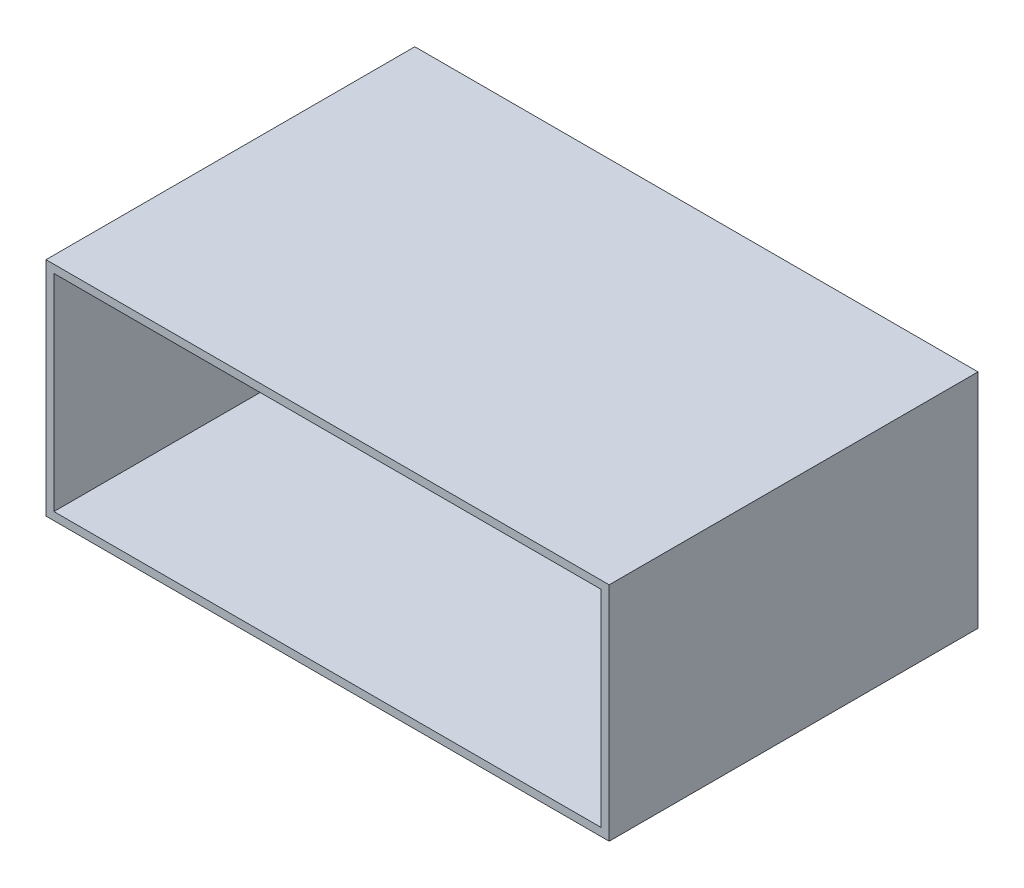
ISO-10303-21;
HEADER;
FILE_DESCRIPTION(('STEP AP214'),'2;1');
FILE_NAME('part.step','',(''),(''),'','','');
FILE_SCHEMA(('AUTOMOTIVE_DESIGN { 1 0 10303 214 1 1 1 1 }'));
ENDSEC;
DATA;
#1=APPLICATION_CONTEXT('core data for automotive mechanical design processes');
#2=APPLICATION_PROTOCOL_DEFINITION('international standard','automotive_design',2000,#1);
#3=PRODUCT_CONTEXT('',#1,'mechanical');
#4=PRODUCT('Part','Part','',(#3));
#5=PRODUCT_RELATED_PRODUCT_CATEGORY('part','',(#4));
#6=PRODUCT_DEFINITION_FORMATION('','',#4);
#7=PRODUCT_DEFINITION_CONTEXT('part definition',#1,'design');
#8=PRODUCT_DEFINITION('design','',#6,#7);
#9=PRODUCT_DEFINITION_SHAPE('','',#8);
#10=(LENGTH_UNIT() NAMED_UNIT(*) SI_UNIT(.MILLI.,.METRE.));
#11=(NAMED_UNIT(*) PLANE_ANGLE_UNIT() SI_UNIT($,.RADIAN.));
#12=(NAMED_UNIT(*) SI_UNIT($,.STERADIAN.) SOLID_ANGLE_UNIT());
#13=UNCERTAINTY_MEASURE_WITH_UNIT(LENGTH_MEASURE(1.E-05),#10,'distance_accuracy_value','');
#14=(GEOMETRIC_REPRESENTATION_CONTEXT(3) GLOBAL_UNCERTAINTY_ASSIGNED_CONTEXT((#13)) GLOBAL_UNIT_ASSIGNED_CONTEXT((#10,
#11,#12)) REPRESENTATION_CONTEXT('',''));
#15=CARTESIAN_POINT('',(0.,0.,0.));
#16=DIRECTION('',(0.,0.,1.));
#17=DIRECTION('',(1.,0.,0.));
#18=AXIS2_PLACEMENT_3D('',#15,#16,#17);
#19=CARTESIAN_POINT('',(0.,0.,93.));
#20=DIRECTION('',(0.,0.,-1.));
#21=DIRECTION('',(-1.,0.,0.));
#22=AXIS2_PLACEMENT_3D('',#19,#20,#21);
#23=PLANE('',#22);
#24=DIRECTION('',(0.,-1.,0.));
#25=VECTOR('',#24,1.);
#26=CARTESIAN_POINT('',(0.,0.,93.));
#27=LINE('',#26,#25);
#28=CARTESIAN_POINT('',(0.,56.,93.));
#29=VERTEX_POINT('',#28);
#30=CARTESIAN_POINT('',(0.,0.,93.));
#31=VERTEX_POINT('',#30);
#32=EDGE_CURVE('E144',#29,#31,#27,.T.);
#33=ORIENTED_EDGE('',*,*,#32,.T.);
#34=DIRECTION('',(1.,0.,0.));
#35=VECTOR('',#34,1.);
#36=CARTESIAN_POINT('',(0.,0.,93.));
#37=LINE('',#36,#35);
#38=CARTESIAN_POINT('',(142.,0.,93.));
#39=VERTEX_POINT('',#38);
#40=EDGE_CURVE('E146',#31,#39,#37,.T.);
#41=ORIENTED_EDGE('',*,*,#40,.T.);
#42=DIRECTION('',(0.,1.,0.));
#43=VECTOR('',#42,1.);
#44=CARTESIAN_POINT('',(142.,0.,93.));
#45=LINE('',#44,#43);
#46=CARTESIAN_POINT('',(142.,56.,93.));
#47=VERTEX_POINT('',#46);
#48=EDGE_CURVE('E151',#39,#47,#45,.T.);
#49=ORIENTED_EDGE('',*,*,#48,.T.);
#50=DIRECTION('',(-1.,0.,0.));
#51=VECTOR('',#50,1.);
#52=CARTESIAN_POINT('',(0.,56.,93.));
#53=LINE('',#52,#51);
#54=EDGE_CURVE('E153',#47,#29,#53,.T.);
#55=ORIENTED_EDGE('',*,*,#54,.T.);
#56=EDGE_LOOP('',(#33,#41,#49,#55));
#57=FACE_BOUND('',#56,.T.);
#58=DIRECTION('',(0.,-1.,0.));
#59=VECTOR('',#58,1.);
#60=CARTESIAN_POINT('',(2.,2.,93.));
#61=LINE('',#60,#59);
#62=CARTESIAN_POINT('',(2.,54.,93.));
#63=VERTEX_POINT('',#62);
#64=CARTESIAN_POINT('',(2.,2.,93.));
#65=VERTEX_POINT('',#64);
#66=EDGE_CURVE('E126',#63,#65,#61,.T.);
#67=ORIENTED_EDGE('',*,*,#66,.F.);
#68=DIRECTION('',(-1.,0.,0.));
#69=VECTOR('',#68,1.);
#70=CARTESIAN_POINT('',(2.,54.,93.));
#71=LINE('',#70,#69);
#72=CARTESIAN_POINT('',(140.,54.,93.));
#73=VERTEX_POINT('',#72);
#74=EDGE_CURVE('E117',#73,#63,#71,.T.);
#75=ORIENTED_EDGE('',*,*,#74,.F.);
#76=DIRECTION('',(0.,1.,0.));
#77=VECTOR('',#76,1.);
#78=CARTESIAN_POINT('',(140.,2.,93.));
#79=LINE('',#78,#77);
#80=CARTESIAN_POINT('',(140.,2.,93.));
#81=VERTEX_POINT('',#80);
#82=EDGE_CURVE('E137',#81,#73,#79,.T.);
#83=ORIENTED_EDGE('',*,*,#82,.F.);
#84=DIRECTION('',(1.,0.,0.));
#85=VECTOR('',#84,1.);
#86=CARTESIAN_POINT('',(2.,2.,93.));
#87=LINE('',#86,#85);
#88=EDGE_CURVE('E128',#65,#81,#87,.T.);
#89=ORIENTED_EDGE('',*,*,#88,.F.);
#90=EDGE_LOOP('',(#67,#75,#83,#89));
#91=FACE_BOUND('',#90,.T.);
#92=ADVANCED_FACE('F43',(#57,#91),#23,.F.);
#93=CARTESIAN_POINT('',(0.,0.,0.));
#94=DIRECTION('',(0.,0.,-1.));
#95=DIRECTION('',(-1.,0.,0.));
#96=AXIS2_PLACEMENT_3D('',#93,#94,#95);
#97=PLANE('',#96);
#98=DIRECTION('',(0.,-1.,0.));
#99=VECTOR('',#98,1.);
#100=CARTESIAN_POINT('',(0.,0.,0.));
#101=LINE('',#100,#99);
#102=CARTESIAN_POINT('',(0.,56.,0.));
#103=VERTEX_POINT('',#102);
#104=CARTESIAN_POINT('',(0.,0.,0.));
#105=VERTEX_POINT('',#104);
#106=EDGE_CURVE('E145',#103,#105,#101,.T.);
#107=ORIENTED_EDGE('',*,*,#106,.F.);
#108=DIRECTION('',(-1.,0.,0.));
#109=VECTOR('',#108,1.);
#110=CARTESIAN_POINT('',(0.,56.,0.));
#111=LINE('',#110,#109);
#112=CARTESIAN_POINT('',(142.,56.,0.));
#113=VERTEX_POINT('',#112);
#114=EDGE_CURVE('E149',#113,#103,#111,.T.);
#115=ORIENTED_EDGE('',*,*,#114,.F.);
#116=DIRECTION('',(0.,1.,0.));
#117=VECTOR('',#116,1.);
#118=CARTESIAN_POINT('',(142.,0.,0.));
#119=LINE('',#118,#117);
#120=CARTESIAN_POINT('',(142.,0.,0.));
#121=VERTEX_POINT('',#120);
#122=EDGE_CURVE('E159',#121,#113,#119,.T.);
#123=ORIENTED_EDGE('',*,*,#122,.F.);
#124=DIRECTION('',(1.,0.,0.));
#125=VECTOR('',#124,1.);
#126=CARTESIAN_POINT('',(0.,0.,0.));
#127=LINE('',#126,#125);
#128=EDGE_CURVE('E158',#105,#121,#127,.T.);
#129=ORIENTED_EDGE('',*,*,#128,.F.);
#130=EDGE_LOOP('',(#107,#115,#123,#129));
#131=FACE_BOUND('',#130,.T.);
#132=ADVANCED_FACE('F180',(#131),#97,.T.);
#133=CARTESIAN_POINT('',(0.,0.,93.));
#134=DIRECTION('',(1.,0.,0.));
#135=DIRECTION('',(0.,0.,-1.));
#136=AXIS2_PLACEMENT_3D('',#133,#134,#135);
#137=PLANE('',#136);
#138=ORIENTED_EDGE('',*,*,#106,.T.);
#139=DIRECTION('',(0.,0.,-1.));
#140=VECTOR('',#139,1.);
#141=CARTESIAN_POINT('',(0.,0.,93.));
#142=LINE('',#141,#140);
#143=EDGE_CURVE('E11',#31,#105,#142,.T.);
#144=ORIENTED_EDGE('',*,*,#143,.F.);
#145=ORIENTED_EDGE('',*,*,#32,.F.);
#146=DIRECTION('',(0.,0.,-1.));
#147=VECTOR('',#146,1.);
#148=CARTESIAN_POINT('',(0.,56.,93.));
#149=LINE('',#148,#147);
#150=EDGE_CURVE('E154',#29,#103,#149,.T.);
#151=ORIENTED_EDGE('',*,*,#150,.T.);
#152=EDGE_LOOP('',(#138,#144,#145,#151));
#153=FACE_BOUND('',#152,.T.);
#154=ADVANCED_FACE('F44',(#153),#137,.F.);
#155=CARTESIAN_POINT('',(0.,0.,93.));
#156=DIRECTION('',(0.,1.,0.));
#157=DIRECTION('',(0.,0.,1.));
#158=AXIS2_PLACEMENT_3D('',#155,#156,#157);
#159=PLANE('',#158);
#160=ORIENTED_EDGE('',*,*,#128,.T.);
#161=DIRECTION('',(0.,0.,-1.));
#162=VECTOR('',#161,1.);
#163=CARTESIAN_POINT('',(142.,0.,93.));
#164=LINE('',#163,#162);
#165=EDGE_CURVE('E51',#39,#121,#164,.T.);
#166=ORIENTED_EDGE('',*,*,#165,.F.);
#167=ORIENTED_EDGE('',*,*,#40,.F.);
#168=ORIENTED_EDGE('',*,*,#143,.T.);
#169=EDGE_LOOP('',(#160,#166,#167,#168));
#170=FACE_BOUND('',#169,.T.);
#171=ADVANCED_FACE('F189',(#170),#159,.F.);
#172=CARTESIAN_POINT('',(142.,0.,93.));
#173=DIRECTION('',(-1.,0.,0.));
#174=DIRECTION('',(0.,0.,1.));
#175=AXIS2_PLACEMENT_3D('',#172,#173,#174);
#176=PLANE('',#175);
#177=ORIENTED_EDGE('',*,*,#122,.T.);
#178=DIRECTION('',(0.,0.,-1.));
#179=VECTOR('',#178,1.);
#180=CARTESIAN_POINT('',(142.,56.,93.));
#181=LINE('',#180,#179);
#182=EDGE_CURVE('E164',#47,#113,#181,.T.);
#183=ORIENTED_EDGE('',*,*,#182,.F.);
#184=ORIENTED_EDGE('',*,*,#48,.F.);
#185=ORIENTED_EDGE('',*,*,#165,.T.);
#186=EDGE_LOOP('',(#177,#183,#184,#185));
#187=FACE_BOUND('',#186,.T.);
#188=ADVANCED_FACE('F175',(#187),#176,.F.);
#189=CARTESIAN_POINT('',(0.,56.,93.));
#190=DIRECTION('',(0.,-1.,0.));
#191=DIRECTION('',(0.,0.,-1.));
#192=AXIS2_PLACEMENT_3D('',#189,#190,#191);
#193=PLANE('',#192);
#194=ORIENTED_EDGE('',*,*,#114,.T.);
#195=ORIENTED_EDGE('',*,*,#150,.F.);
#196=ORIENTED_EDGE('',*,*,#54,.F.);
#197=ORIENTED_EDGE('',*,*,#182,.T.);
#198=EDGE_LOOP('',(#194,#195,#196,#197));
#199=FACE_BOUND('',#198,.T.);
#200=ADVANCED_FACE('F182',(#199),#193,.F.);
#201=CARTESIAN_POINT('',(2.,2.,93.));
#202=DIRECTION('',(1.,0.,0.));
#203=DIRECTION('',(0.,0.,-1.));
#204=AXIS2_PLACEMENT_3D('',#201,#202,#203);
#205=PLANE('',#204);
#206=DIRECTION('',(0.,-1.,0.));
#207=VECTOR('',#206,1.);
#208=CARTESIAN_POINT('',(2.,2.,2.));
#209=LINE('',#208,#207);
#210=CARTESIAN_POINT('',(2.,54.,2.));
#211=VERTEX_POINT('',#210);
#212=CARTESIAN_POINT('',(2.,2.,2.00000000000003));
#213=VERTEX_POINT('',#212);
#214=EDGE_CURVE('E124',#211,#213,#209,.T.);
#215=ORIENTED_EDGE('',*,*,#214,.F.);
#216=DIRECTION('',(0.,0.,-1.));
#217=VECTOR('',#216,1.);
#218=CARTESIAN_POINT('',(2.,54.,93.));
#219=LINE('',#218,#217);
#220=EDGE_CURVE('E109',#63,#211,#219,.T.);
#221=ORIENTED_EDGE('',*,*,#220,.F.);
#222=ORIENTED_EDGE('',*,*,#66,.T.);
#223=DIRECTION('',(0.,0.,-1.));
#224=VECTOR('',#223,1.);
#225=CARTESIAN_POINT('',(2.,2.,93.));
#226=LINE('',#225,#224);
#227=EDGE_CURVE('E121',#65,#213,#226,.T.);
#228=ORIENTED_EDGE('',*,*,#227,.T.);
#229=EDGE_LOOP('',(#215,#221,#222,#228));
#230=FACE_BOUND('',#229,.T.);
#231=ADVANCED_FACE('F125',(#230),#205,.T.);
#232=CARTESIAN_POINT('',(2.,2.,93.));
#233=DIRECTION('',(0.,1.,0.));
#234=DIRECTION('',(0.,0.,1.));
#235=AXIS2_PLACEMENT_3D('',#232,#233,#234);
#236=PLANE('',#235);
#237=DIRECTION('',(1.,0.,0.));
#238=VECTOR('',#237,1.);
#239=CARTESIAN_POINT('',(2.,2.,2.));
#240=LINE('',#239,#238);
#241=CARTESIAN_POINT('',(140.,2.,2.00000000000003));
#242=VERTEX_POINT('',#241);
#243=EDGE_CURVE('E59',#213,#242,#240,.T.);
#244=ORIENTED_EDGE('',*,*,#243,.F.);
#245=ORIENTED_EDGE('',*,*,#227,.F.);
#246=ORIENTED_EDGE('',*,*,#88,.T.);
#247=DIRECTION('',(0.,0.,-1.));
#248=VECTOR('',#247,1.);
#249=CARTESIAN_POINT('',(140.,2.,93.));
#250=LINE('',#249,#248);
#251=EDGE_CURVE('E143',#81,#242,#250,.T.);
#252=ORIENTED_EDGE('',*,*,#251,.T.);
#253=EDGE_LOOP('',(#244,#245,#246,#252));
#254=FACE_BOUND('',#253,.T.);
#255=ADVANCED_FACE('F208',(#254),#236,.T.);
#256=CARTESIAN_POINT('',(140.,2.,93.));
#257=DIRECTION('',(-1.,0.,0.));
#258=DIRECTION('',(0.,0.,1.));
#259=AXIS2_PLACEMENT_3D('',#256,#257,#258);
#260=PLANE('',#259);
#261=DIRECTION('',(0.,1.,0.));
#262=VECTOR('',#261,1.);
#263=CARTESIAN_POINT('',(140.,2.,2.));
#264=LINE('',#263,#262);
#265=CARTESIAN_POINT('',(140.,54.,2.00000000000003));
#266=VERTEX_POINT('',#265);
#267=EDGE_CURVE('E67',#242,#266,#264,.T.);
#268=ORIENTED_EDGE('',*,*,#267,.F.);
#269=ORIENTED_EDGE('',*,*,#251,.F.);
#270=ORIENTED_EDGE('',*,*,#82,.T.);
#271=DIRECTION('',(0.,0.,-1.));
#272=VECTOR('',#271,1.);
#273=CARTESIAN_POINT('',(140.,54.,93.));
#274=LINE('',#273,#272);
#275=EDGE_CURVE('E116',#73,#266,#274,.T.);
#276=ORIENTED_EDGE('',*,*,#275,.T.);
#277=EDGE_LOOP('',(#268,#269,#270,#276));
#278=FACE_BOUND('',#277,.T.);
#279=ADVANCED_FACE('F215',(#278),#260,.T.);
#280=CARTESIAN_POINT('',(2.,54.,93.));
#281=DIRECTION('',(0.,-1.,0.));
#282=DIRECTION('',(0.,0.,-1.));
#283=AXIS2_PLACEMENT_3D('',#280,#281,#282);
#284=PLANE('',#283);
#285=DIRECTION('',(-1.,0.,0.));
#286=VECTOR('',#285,1.);
#287=CARTESIAN_POINT('',(2.,54.,2.));
#288=LINE('',#287,#286);
#289=EDGE_CURVE('E111',#266,#211,#288,.T.);
#290=ORIENTED_EDGE('',*,*,#289,.F.);
#291=ORIENTED_EDGE('',*,*,#275,.F.);
#292=ORIENTED_EDGE('',*,*,#74,.T.);
#293=ORIENTED_EDGE('',*,*,#220,.T.);
#294=EDGE_LOOP('',(#290,#291,#292,#293));
#295=FACE_BOUND('',#294,.T.);
#296=ADVANCED_FACE('F115',(#295),#284,.T.);
#297=CARTESIAN_POINT('',(0.,0.,2.));
#298=DIRECTION('',(0.,0.,-1.));
#299=DIRECTION('',(-1.,0.,0.));
#300=AXIS2_PLACEMENT_3D('',#297,#298,#299);
#301=PLANE('',#300);
#302=ORIENTED_EDGE('',*,*,#214,.T.);
#303=ORIENTED_EDGE('',*,*,#243,.T.);
#304=ORIENTED_EDGE('',*,*,#267,.T.);
#305=ORIENTED_EDGE('',*,*,#289,.T.);
#306=EDGE_LOOP('',(#302,#303,#304,#305));
#307=FACE_BOUND('',#306,.T.);
#308=ADVANCED_FACE('F130',(#307),#301,.F.);
#309=CLOSED_SHELL('',(#92,#132,#154,#171,#188,#200,#231,#255,#279,#296,#308));
#310=MANIFOLD_SOLID_BREP('B2',#309);
#311=ADVANCED_BREP_SHAPE_REPRESENTATION('',(#18,#310),#14);
#312=SHAPE_DEFINITION_REPRESENTATION(#9,#311);
ENDSEC;
END-ISO-10303-21;
